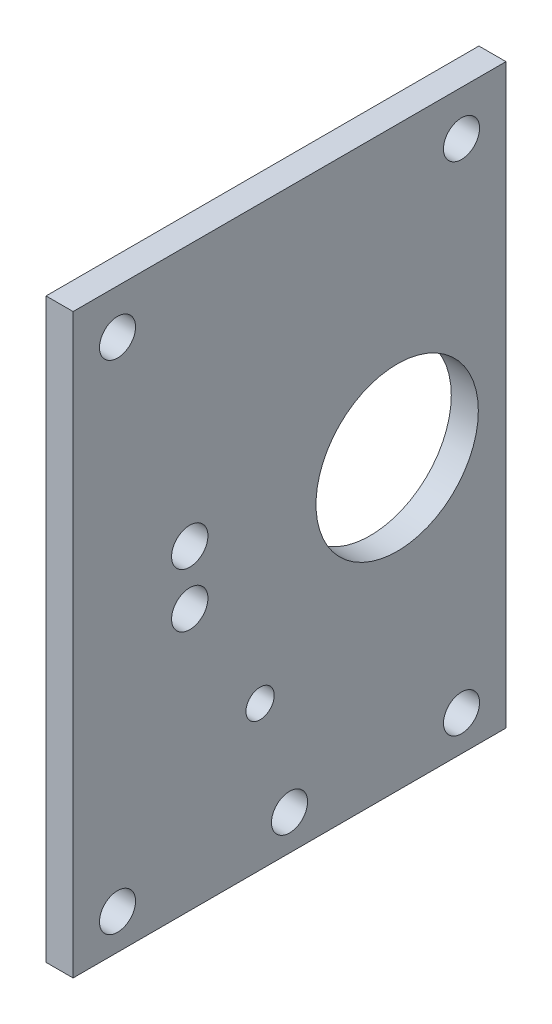
ISO-10303-21;
HEADER;
FILE_DESCRIPTION(('STEP AP214'),'2;1');
FILE_NAME('part.step','',(''),(''),'','','');
FILE_SCHEMA(('AUTOMOTIVE_DESIGN { 1 0 10303 214 1 1 1 1 }'));
ENDSEC;
DATA;
#1=APPLICATION_CONTEXT('core data for automotive mechanical design processes');
#2=APPLICATION_PROTOCOL_DEFINITION('international standard','automotive_design',2000,#1);
#3=PRODUCT_CONTEXT('',#1,'mechanical');
#4=PRODUCT('Part','Part','',(#3));
#5=PRODUCT_RELATED_PRODUCT_CATEGORY('part','',(#4));
#6=PRODUCT_DEFINITION_FORMATION('','',#4);
#7=PRODUCT_DEFINITION_CONTEXT('part definition',#1,'design');
#8=PRODUCT_DEFINITION('design','',#6,#7);
#9=PRODUCT_DEFINITION_SHAPE('','',#8);
#10=(LENGTH_UNIT() NAMED_UNIT(*) SI_UNIT(.MILLI.,.METRE.));
#11=(NAMED_UNIT(*) PLANE_ANGLE_UNIT() SI_UNIT($,.RADIAN.));
#12=(NAMED_UNIT(*) SI_UNIT($,.STERADIAN.) SOLID_ANGLE_UNIT());
#13=UNCERTAINTY_MEASURE_WITH_UNIT(LENGTH_MEASURE(1.E-05),#10,'distance_accuracy_value','');
#14=(GEOMETRIC_REPRESENTATION_CONTEXT(3) GLOBAL_UNCERTAINTY_ASSIGNED_CONTEXT((#13)) GLOBAL_UNIT_ASSIGNED_CONTEXT((#10,
#11,#12)) REPRESENTATION_CONTEXT('',''));
#15=CARTESIAN_POINT('',(0.,0.,0.));
#16=DIRECTION('',(0.,0.,1.));
#17=DIRECTION('',(1.,0.,0.));
#18=AXIS2_PLACEMENT_3D('',#15,#16,#17);
#19=CARTESIAN_POINT('',(4.7625,-50.8,-38.1));
#20=DIRECTION('',(0.,0.,1.));
#21=DIRECTION('',(1.,0.,0.));
#22=AXIS2_PLACEMENT_3D('',#19,#20,#21);
#23=PLANE('',#22);
#24=DIRECTION('',(0.,1.,0.));
#25=VECTOR('',#24,1.);
#26=CARTESIAN_POINT('',(0.,-50.8,-38.1));
#27=LINE('',#26,#25);
#28=CARTESIAN_POINT('',(0.,-50.8,-38.1));
#29=VERTEX_POINT('',#28);
#30=CARTESIAN_POINT('',(0.,50.8,-38.1));
#31=VERTEX_POINT('',#30);
#32=EDGE_CURVE('E99',#29,#31,#27,.T.);
#33=ORIENTED_EDGE('',*,*,#32,.T.);
#34=DIRECTION('',(-1.,0.,0.));
#35=VECTOR('',#34,1.);
#36=CARTESIAN_POINT('',(4.7625,50.8,-38.1));
#37=LINE('',#36,#35);
#38=CARTESIAN_POINT('',(4.7625,50.8,-38.1));
#39=VERTEX_POINT('',#38);
#40=EDGE_CURVE('E11',#39,#31,#37,.T.);
#41=ORIENTED_EDGE('',*,*,#40,.F.);
#42=DIRECTION('',(0.,1.,0.));
#43=VECTOR('',#42,1.);
#44=CARTESIAN_POINT('',(4.7625,-50.8,-38.1));
#45=LINE('',#44,#43);
#46=CARTESIAN_POINT('',(4.7625,-50.8,-38.1));
#47=VERTEX_POINT('',#46);
#48=EDGE_CURVE('E86',#47,#39,#45,.T.);
#49=ORIENTED_EDGE('',*,*,#48,.F.);
#50=DIRECTION('',(-1.,0.,0.));
#51=VECTOR('',#50,1.);
#52=CARTESIAN_POINT('',(4.7625,-50.8,-38.1));
#53=LINE('',#52,#51);
#54=EDGE_CURVE('E95',#47,#29,#53,.T.);
#55=ORIENTED_EDGE('',*,*,#54,.T.);
#56=EDGE_LOOP('',(#33,#41,#49,#55));
#57=FACE_BOUND('',#56,.T.);
#58=ADVANCED_FACE('F33',(#57),#23,.F.);
#59=CARTESIAN_POINT('',(4.7625,50.8,38.1));
#60=DIRECTION('',(0.,-1.,0.));
#61=DIRECTION('',(0.,0.,-1.));
#62=AXIS2_PLACEMENT_3D('',#59,#60,#61);
#63=PLANE('',#62);
#64=DIRECTION('',(0.,0.,1.));
#65=VECTOR('',#64,1.);
#66=CARTESIAN_POINT('',(0.,50.8,38.1));
#67=LINE('',#66,#65);
#68=CARTESIAN_POINT('',(0.,50.8,38.1));
#69=VERTEX_POINT('',#68);
#70=EDGE_CURVE('E90',#31,#69,#67,.T.);
#71=ORIENTED_EDGE('',*,*,#70,.T.);
#72=DIRECTION('',(-1.,0.,0.));
#73=VECTOR('',#72,1.);
#74=CARTESIAN_POINT('',(4.7625,50.8,38.1));
#75=LINE('',#74,#73);
#76=CARTESIAN_POINT('',(4.7625,50.8,38.1));
#77=VERTEX_POINT('',#76);
#78=EDGE_CURVE('E42',#77,#69,#75,.T.);
#79=ORIENTED_EDGE('',*,*,#78,.F.);
#80=DIRECTION('',(0.,0.,1.));
#81=VECTOR('',#80,1.);
#82=CARTESIAN_POINT('',(4.7625,50.8,38.1));
#83=LINE('',#82,#81);
#84=EDGE_CURVE('E81',#39,#77,#83,.T.);
#85=ORIENTED_EDGE('',*,*,#84,.F.);
#86=ORIENTED_EDGE('',*,*,#40,.T.);
#87=EDGE_LOOP('',(#71,#79,#85,#86));
#88=FACE_BOUND('',#87,.T.);
#89=ADVANCED_FACE('F89',(#88),#63,.F.);
#90=CARTESIAN_POINT('',(4.7625,-50.8,38.1));
#91=DIRECTION('',(0.,0.,-1.));
#92=DIRECTION('',(-1.,0.,0.));
#93=AXIS2_PLACEMENT_3D('',#90,#91,#92);
#94=PLANE('',#93);
#95=DIRECTION('',(0.,-1.,0.));
#96=VECTOR('',#95,1.);
#97=CARTESIAN_POINT('',(0.,-50.8,38.1));
#98=LINE('',#97,#96);
#99=CARTESIAN_POINT('',(0.,-50.8,38.1));
#100=VERTEX_POINT('',#99);
#101=EDGE_CURVE('E68',#69,#100,#98,.T.);
#102=ORIENTED_EDGE('',*,*,#101,.T.);
#103=DIRECTION('',(-1.,0.,0.));
#104=VECTOR('',#103,1.);
#105=CARTESIAN_POINT('',(4.7625,-50.8,38.1));
#106=LINE('',#105,#104);
#107=CARTESIAN_POINT('',(4.7625,-50.8,38.1));
#108=VERTEX_POINT('',#107);
#109=EDGE_CURVE('E91',#108,#100,#106,.T.);
#110=ORIENTED_EDGE('',*,*,#109,.F.);
#111=DIRECTION('',(0.,-1.,0.));
#112=VECTOR('',#111,1.);
#113=CARTESIAN_POINT('',(4.7625,-50.8,38.1));
#114=LINE('',#113,#112);
#115=EDGE_CURVE('E84',#77,#108,#114,.T.);
#116=ORIENTED_EDGE('',*,*,#115,.F.);
#117=ORIENTED_EDGE('',*,*,#78,.T.);
#118=EDGE_LOOP('',(#102,#110,#116,#117));
#119=FACE_BOUND('',#118,.T.);
#120=ADVANCED_FACE('F93',(#119),#94,.F.);
#121=CARTESIAN_POINT('',(4.7625,-50.8,38.1));
#122=DIRECTION('',(0.,1.,0.));
#123=DIRECTION('',(0.,0.,1.));
#124=AXIS2_PLACEMENT_3D('',#121,#122,#123);
#125=PLANE('',#124);
#126=DIRECTION('',(0.,0.,-1.));
#127=VECTOR('',#126,1.);
#128=CARTESIAN_POINT('',(0.,-50.8,38.1));
#129=LINE('',#128,#127);
#130=EDGE_CURVE('E74',#100,#29,#129,.T.);
#131=ORIENTED_EDGE('',*,*,#130,.T.);
#132=ORIENTED_EDGE('',*,*,#54,.F.);
#133=DIRECTION('',(0.,0.,-1.));
#134=VECTOR('',#133,1.);
#135=CARTESIAN_POINT('',(4.7625,-50.8,38.1));
#136=LINE('',#135,#134);
#137=EDGE_CURVE('E51',#108,#47,#136,.T.);
#138=ORIENTED_EDGE('',*,*,#137,.F.);
#139=ORIENTED_EDGE('',*,*,#109,.T.);
#140=EDGE_LOOP('',(#131,#132,#138,#139));
#141=FACE_BOUND('',#140,.T.);
#142=ADVANCED_FACE('F155',(#141),#125,.F.);
#143=CARTESIAN_POINT('',(4.7625,0.,0.));
#144=DIRECTION('',(-1.,0.,0.));
#145=DIRECTION('',(0.,0.,1.));
#146=AXIS2_PLACEMENT_3D('',#143,#144,#145);
#147=PLANE('',#146);
#148=CARTESIAN_POINT('',(4.7625,-4.76250000000003,17.5641));
#149=DIRECTION('',(1.,0.,0.));
#150=DIRECTION('',(0.,0.,-1.));
#151=AXIS2_PLACEMENT_3D('',#148,#149,#150);
#152=CIRCLE('',#151,3.19999999999999);
#153=CARTESIAN_POINT('',(4.7625,-4.76250000000003,14.3641));
#154=VERTEX_POINT('',#153);
#155=EDGE_CURVE('E286',#154,#154,#152,.T.);
#156=ORIENTED_EDGE('',*,*,#155,.F.);
#157=EDGE_LOOP('',(#156));
#158=FACE_BOUND('',#157,.T.);
#159=CARTESIAN_POINT('',(4.7625,4.76249999999997,17.5641));
#160=DIRECTION('',(1.,0.,0.));
#161=DIRECTION('',(0.,0.,-1.));
#162=AXIS2_PLACEMENT_3D('',#159,#160,#161);
#163=CIRCLE('',#162,3.19999999999999);
#164=CARTESIAN_POINT('',(4.7625,4.76249999999997,14.3641));
#165=VERTEX_POINT('',#164);
#166=EDGE_CURVE('E290',#165,#165,#163,.T.);
#167=ORIENTED_EDGE('',*,*,#166,.F.);
#168=EDGE_LOOP('',(#167));
#169=FACE_BOUND('',#168,.T.);
#170=CARTESIAN_POINT('',(4.7625,-44.5643,0.));
#171=DIRECTION('',(1.,0.,0.));
#172=DIRECTION('',(0.,0.,-1.));
#173=AXIS2_PLACEMENT_3D('',#170,#171,#172);
#174=CIRCLE('',#173,3.175);
#175=CARTESIAN_POINT('',(4.7625,-44.5643,-3.175));
#176=VERTEX_POINT('',#175);
#177=EDGE_CURVE('E138',#176,#176,#174,.T.);
#178=ORIENTED_EDGE('',*,*,#177,.F.);
#179=EDGE_LOOP('',(#178));
#180=FACE_BOUND('',#179,.T.);
#181=CARTESIAN_POINT('',(4.7625,-25.4,5.1816));
#182=DIRECTION('',(1.,0.,0.));
#183=DIRECTION('',(0.,0.,-1.));
#184=AXIS2_PLACEMENT_3D('',#181,#182,#183);
#185=CIRCLE('',#184,2.4892);
#186=CARTESIAN_POINT('',(4.7625,-25.4,2.6924));
#187=VERTEX_POINT('',#186);
#188=EDGE_CURVE('E128',#187,#187,#185,.T.);
#189=ORIENTED_EDGE('',*,*,#188,.F.);
#190=EDGE_LOOP('',(#189));
#191=FACE_BOUND('',#190,.T.);
#192=CARTESIAN_POINT('',(4.7625,0.,-18.9484));
#193=DIRECTION('',(1.,0.,0.));
#194=DIRECTION('',(0.,0.,-1.));
#195=AXIS2_PLACEMENT_3D('',#192,#193,#194);
#196=CIRCLE('',#195,14.2875);
#197=CARTESIAN_POINT('',(4.7625,0.,-33.2359));
#198=VERTEX_POINT('',#197);
#199=EDGE_CURVE('E125',#198,#198,#196,.T.);
#200=ORIENTED_EDGE('',*,*,#199,.F.);
#201=EDGE_LOOP('',(#200));
#202=FACE_BOUND('',#201,.T.);
#203=CARTESIAN_POINT('',(4.7625,-44.5643,30.2768));
#204=DIRECTION('',(1.,0.,0.));
#205=DIRECTION('',(0.,0.,-1.));
#206=AXIS2_PLACEMENT_3D('',#203,#204,#205);
#207=CIRCLE('',#206,3.175);
#208=CARTESIAN_POINT('',(4.7625,-44.5643,27.1018));
#209=VERTEX_POINT('',#208);
#210=EDGE_CURVE('E122',#209,#209,#207,.T.);
#211=ORIENTED_EDGE('',*,*,#210,.F.);
#212=EDGE_LOOP('',(#211));
#213=FACE_BOUND('',#212,.T.);
#214=CARTESIAN_POINT('',(4.7625,42.9768,30.2768));
#215=DIRECTION('',(1.,0.,0.));
#216=DIRECTION('',(0.,0.,-1.));
#217=AXIS2_PLACEMENT_3D('',#214,#215,#216);
#218=CIRCLE('',#217,3.175);
#219=CARTESIAN_POINT('',(4.7625,42.9768,27.1018));
#220=VERTEX_POINT('',#219);
#221=EDGE_CURVE('E118',#220,#220,#218,.T.);
#222=ORIENTED_EDGE('',*,*,#221,.F.);
#223=EDGE_LOOP('',(#222));
#224=FACE_BOUND('',#223,.T.);
#225=CARTESIAN_POINT('',(4.7625,-44.5643,-30.2768));
#226=DIRECTION('',(1.,0.,0.));
#227=DIRECTION('',(0.,0.,-1.));
#228=AXIS2_PLACEMENT_3D('',#225,#226,#227);
#229=CIRCLE('',#228,3.17499999999999);
#230=CARTESIAN_POINT('',(4.7625,-44.5643,-33.4518));
#231=VERTEX_POINT('',#230);
#232=EDGE_CURVE('E114',#231,#231,#229,.T.);
#233=ORIENTED_EDGE('',*,*,#232,.F.);
#234=EDGE_LOOP('',(#233));
#235=FACE_BOUND('',#234,.T.);
#236=CARTESIAN_POINT('',(4.7625,42.9768,-30.2768));
#237=DIRECTION('',(1.,0.,0.));
#238=DIRECTION('',(0.,0.,-1.));
#239=AXIS2_PLACEMENT_3D('',#236,#237,#238);
#240=CIRCLE('',#239,3.175);
#241=CARTESIAN_POINT('',(4.7625,42.9768,-33.4518));
#242=VERTEX_POINT('',#241);
#243=EDGE_CURVE('E110',#242,#242,#240,.T.);
#244=ORIENTED_EDGE('',*,*,#243,.F.);
#245=EDGE_LOOP('',(#244));
#246=FACE_BOUND('',#245,.T.);
#247=ORIENTED_EDGE('',*,*,#48,.T.);
#248=ORIENTED_EDGE('',*,*,#84,.T.);
#249=ORIENTED_EDGE('',*,*,#115,.T.);
#250=ORIENTED_EDGE('',*,*,#137,.T.);
#251=EDGE_LOOP('',(#247,#248,#249,#250));
#252=FACE_BOUND('',#251,.T.);
#253=ADVANCED_FACE('F82',(#158,#169,#180,#191,#202,#213,#224,#235,#246,#252),#147,.F.);
#254=CARTESIAN_POINT('',(0.,0.,0.));
#255=DIRECTION('',(-1.,0.,0.));
#256=DIRECTION('',(0.,0.,1.));
#257=AXIS2_PLACEMENT_3D('',#254,#255,#256);
#258=PLANE('',#257);
#259=CARTESIAN_POINT('',(0.,-4.76250000000003,17.5641));
#260=DIRECTION('',(-1.,0.,0.));
#261=DIRECTION('',(0.,0.,1.));
#262=AXIS2_PLACEMENT_3D('',#259,#260,#261);
#263=CIRCLE('',#262,3.19999999999999);
#264=CARTESIAN_POINT('',(0.,-4.76250000000003,20.7641));
#265=VERTEX_POINT('',#264);
#266=EDGE_CURVE('E289',#265,#265,#263,.T.);
#267=ORIENTED_EDGE('',*,*,#266,.F.);
#268=EDGE_LOOP('',(#267));
#269=FACE_BOUND('',#268,.T.);
#270=CARTESIAN_POINT('',(0.,4.76249999999997,17.5641));
#271=DIRECTION('',(-1.,0.,0.));
#272=DIRECTION('',(0.,0.,1.));
#273=AXIS2_PLACEMENT_3D('',#270,#271,#272);
#274=CIRCLE('',#273,3.19999999999999);
#275=CARTESIAN_POINT('',(0.,4.76249999999997,20.7641));
#276=VERTEX_POINT('',#275);
#277=EDGE_CURVE('E293',#276,#276,#274,.T.);
#278=ORIENTED_EDGE('',*,*,#277,.F.);
#279=EDGE_LOOP('',(#278));
#280=FACE_BOUND('',#279,.T.);
#281=CARTESIAN_POINT('',(0.,-44.5643,0.));
#282=DIRECTION('',(-1.,0.,0.));
#283=DIRECTION('',(0.,0.,1.));
#284=AXIS2_PLACEMENT_3D('',#281,#282,#283);
#285=CIRCLE('',#284,3.175);
#286=CARTESIAN_POINT('',(0.,-44.5643,3.175));
#287=VERTEX_POINT('',#286);
#288=EDGE_CURVE('E36',#287,#287,#285,.T.);
#289=ORIENTED_EDGE('',*,*,#288,.F.);
#290=EDGE_LOOP('',(#289));
#291=FACE_BOUND('',#290,.T.);
#292=CARTESIAN_POINT('',(0.,-25.4,5.1816));
#293=DIRECTION('',(-1.,0.,0.));
#294=DIRECTION('',(0.,0.,1.));
#295=AXIS2_PLACEMENT_3D('',#292,#293,#294);
#296=CIRCLE('',#295,2.4892);
#297=CARTESIAN_POINT('',(0.,-25.4,7.6708));
#298=VERTEX_POINT('',#297);
#299=EDGE_CURVE('E126',#298,#298,#296,.T.);
#300=ORIENTED_EDGE('',*,*,#299,.F.);
#301=EDGE_LOOP('',(#300));
#302=FACE_BOUND('',#301,.T.);
#303=CARTESIAN_POINT('',(0.,0.,-18.9484));
#304=DIRECTION('',(-1.,0.,0.));
#305=DIRECTION('',(0.,0.,1.));
#306=AXIS2_PLACEMENT_3D('',#303,#304,#305);
#307=CIRCLE('',#306,14.2875);
#308=CARTESIAN_POINT('',(0.,0.,-4.66089999999999));
#309=VERTEX_POINT('',#308);
#310=EDGE_CURVE('E123',#309,#309,#307,.T.);
#311=ORIENTED_EDGE('',*,*,#310,.F.);
#312=EDGE_LOOP('',(#311));
#313=FACE_BOUND('',#312,.T.);
#314=CARTESIAN_POINT('',(0.,-44.5643,30.2768));
#315=DIRECTION('',(-1.,0.,0.));
#316=DIRECTION('',(0.,0.,1.));
#317=AXIS2_PLACEMENT_3D('',#314,#315,#316);
#318=CIRCLE('',#317,3.175);
#319=CARTESIAN_POINT('',(0.,-44.5643,33.4518));
#320=VERTEX_POINT('',#319);
#321=EDGE_CURVE('E119',#320,#320,#318,.T.);
#322=ORIENTED_EDGE('',*,*,#321,.F.);
#323=EDGE_LOOP('',(#322));
#324=FACE_BOUND('',#323,.T.);
#325=CARTESIAN_POINT('',(0.,42.9768,30.2768));
#326=DIRECTION('',(-1.,0.,0.));
#327=DIRECTION('',(0.,0.,1.));
#328=AXIS2_PLACEMENT_3D('',#325,#326,#327);
#329=CIRCLE('',#328,3.175);
#330=CARTESIAN_POINT('',(0.,42.9768,33.4518));
#331=VERTEX_POINT('',#330);
#332=EDGE_CURVE('E115',#331,#331,#329,.T.);
#333=ORIENTED_EDGE('',*,*,#332,.F.);
#334=EDGE_LOOP('',(#333));
#335=FACE_BOUND('',#334,.T.);
#336=CARTESIAN_POINT('',(0.,-44.5643,-30.2768));
#337=DIRECTION('',(-1.,0.,0.));
#338=DIRECTION('',(0.,0.,1.));
#339=AXIS2_PLACEMENT_3D('',#336,#337,#338);
#340=CIRCLE('',#339,3.17499999999999);
#341=CARTESIAN_POINT('',(0.,-44.5643,-27.1018));
#342=VERTEX_POINT('',#341);
#343=EDGE_CURVE('E111',#342,#342,#340,.T.);
#344=ORIENTED_EDGE('',*,*,#343,.F.);
#345=EDGE_LOOP('',(#344));
#346=FACE_BOUND('',#345,.T.);
#347=CARTESIAN_POINT('',(0.,42.9768,-30.2768));
#348=DIRECTION('',(-1.,0.,0.));
#349=DIRECTION('',(0.,0.,1.));
#350=AXIS2_PLACEMENT_3D('',#347,#348,#349);
#351=CIRCLE('',#350,3.175);
#352=CARTESIAN_POINT('',(0.,42.9768,-27.1018));
#353=VERTEX_POINT('',#352);
#354=EDGE_CURVE('E102',#353,#353,#351,.T.);
#355=ORIENTED_EDGE('',*,*,#354,.F.);
#356=EDGE_LOOP('',(#355));
#357=FACE_BOUND('',#356,.T.);
#358=ORIENTED_EDGE('',*,*,#32,.F.);
#359=ORIENTED_EDGE('',*,*,#130,.F.);
#360=ORIENTED_EDGE('',*,*,#101,.F.);
#361=ORIENTED_EDGE('',*,*,#70,.F.);
#362=EDGE_LOOP('',(#358,#359,#360,#361));
#363=FACE_BOUND('',#362,.T.);
#364=ADVANCED_FACE('F154',(#269,#280,#291,#302,#313,#324,#335,#346,#357,#363),#258,.T.);
#365=CARTESIAN_POINT('',(-1.5875,42.9768,-30.2768));
#366=DIRECTION('',(1.,0.,0.));
#367=DIRECTION('',(0.,0.,-1.));
#368=AXIS2_PLACEMENT_3D('',#365,#366,#367);
#369=CYLINDRICAL_SURFACE('',#368,3.175);
#370=ORIENTED_EDGE('',*,*,#354,.T.);
#371=EDGE_LOOP('',(#370));
#372=FACE_BOUND('',#371,.T.);
#373=ORIENTED_EDGE('',*,*,#243,.T.);
#374=EDGE_LOOP('',(#373));
#375=FACE_BOUND('',#374,.T.);
#376=ADVANCED_FACE('F151',(#372,#375),#369,.F.);
#377=CARTESIAN_POINT('',(-1.5875,-44.5643,-30.2768));
#378=DIRECTION('',(1.,0.,0.));
#379=DIRECTION('',(0.,0.,-1.));
#380=AXIS2_PLACEMENT_3D('',#377,#378,#379);
#381=CYLINDRICAL_SURFACE('',#380,3.17499999999999);
#382=ORIENTED_EDGE('',*,*,#343,.T.);
#383=EDGE_LOOP('',(#382));
#384=FACE_BOUND('',#383,.T.);
#385=ORIENTED_EDGE('',*,*,#232,.T.);
#386=EDGE_LOOP('',(#385));
#387=FACE_BOUND('',#386,.T.);
#388=ADVANCED_FACE('F204',(#384,#387),#381,.F.);
#389=CARTESIAN_POINT('',(-1.5875,42.9768,30.2768));
#390=DIRECTION('',(1.,0.,0.));
#391=DIRECTION('',(0.,0.,-1.));
#392=AXIS2_PLACEMENT_3D('',#389,#390,#391);
#393=CYLINDRICAL_SURFACE('',#392,3.175);
#394=ORIENTED_EDGE('',*,*,#332,.T.);
#395=EDGE_LOOP('',(#394));
#396=FACE_BOUND('',#395,.T.);
#397=ORIENTED_EDGE('',*,*,#221,.T.);
#398=EDGE_LOOP('',(#397));
#399=FACE_BOUND('',#398,.T.);
#400=ADVANCED_FACE('F210',(#396,#399),#393,.F.);
#401=CARTESIAN_POINT('',(-1.5875,-44.5643,30.2768));
#402=DIRECTION('',(1.,0.,0.));
#403=DIRECTION('',(0.,0.,-1.));
#404=AXIS2_PLACEMENT_3D('',#401,#402,#403);
#405=CYLINDRICAL_SURFACE('',#404,3.175);
#406=ORIENTED_EDGE('',*,*,#321,.T.);
#407=EDGE_LOOP('',(#406));
#408=FACE_BOUND('',#407,.T.);
#409=ORIENTED_EDGE('',*,*,#210,.T.);
#410=EDGE_LOOP('',(#409));
#411=FACE_BOUND('',#410,.T.);
#412=ADVANCED_FACE('F218',(#408,#411),#405,.F.);
#413=CARTESIAN_POINT('',(-1.5875,0.,-18.9484));
#414=DIRECTION('',(1.,0.,0.));
#415=DIRECTION('',(0.,0.,-1.));
#416=AXIS2_PLACEMENT_3D('',#413,#414,#415);
#417=CYLINDRICAL_SURFACE('',#416,14.2875);
#418=ORIENTED_EDGE('',*,*,#310,.T.);
#419=EDGE_LOOP('',(#418));
#420=FACE_BOUND('',#419,.T.);
#421=ORIENTED_EDGE('',*,*,#199,.T.);
#422=EDGE_LOOP('',(#421));
#423=FACE_BOUND('',#422,.T.);
#424=ADVANCED_FACE('F226',(#420,#423),#417,.F.);
#425=CARTESIAN_POINT('',(-1.5875,-25.4,5.1816));
#426=DIRECTION('',(1.,0.,0.));
#427=DIRECTION('',(0.,0.,-1.));
#428=AXIS2_PLACEMENT_3D('',#425,#426,#427);
#429=CYLINDRICAL_SURFACE('',#428,2.4892);
#430=ORIENTED_EDGE('',*,*,#299,.T.);
#431=EDGE_LOOP('',(#430));
#432=FACE_BOUND('',#431,.T.);
#433=ORIENTED_EDGE('',*,*,#188,.T.);
#434=EDGE_LOOP('',(#433));
#435=FACE_BOUND('',#434,.T.);
#436=ADVANCED_FACE('F234',(#432,#435),#429,.F.);
#437=CARTESIAN_POINT('',(-1.5875,-44.5643,0.));
#438=DIRECTION('',(1.,0.,0.));
#439=DIRECTION('',(0.,0.,-1.));
#440=AXIS2_PLACEMENT_3D('',#437,#438,#439);
#441=CYLINDRICAL_SURFACE('',#440,3.175);
#442=ORIENTED_EDGE('',*,*,#288,.T.);
#443=EDGE_LOOP('',(#442));
#444=FACE_BOUND('',#443,.T.);
#445=ORIENTED_EDGE('',*,*,#177,.T.);
#446=EDGE_LOOP('',(#445));
#447=FACE_BOUND('',#446,.T.);
#448=ADVANCED_FACE('F242',(#444,#447),#441,.F.);
#449=CARTESIAN_POINT('',(4.7625,4.76249999999997,17.5641));
#450=DIRECTION('',(1.,0.,0.));
#451=DIRECTION('',(0.,0.,-1.));
#452=AXIS2_PLACEMENT_3D('',#449,#450,#451);
#453=CYLINDRICAL_SURFACE('',#452,3.19999999999999);
#454=ORIENTED_EDGE('',*,*,#166,.T.);
#455=EDGE_LOOP('',(#454));
#456=FACE_BOUND('',#455,.T.);
#457=ORIENTED_EDGE('',*,*,#277,.T.);
#458=EDGE_LOOP('',(#457));
#459=FACE_BOUND('',#458,.T.);
#460=ADVANCED_FACE('F248',(#456,#459),#453,.F.);
#461=CARTESIAN_POINT('',(4.7625,-4.76250000000003,17.5641));
#462=DIRECTION('',(1.,0.,0.));
#463=DIRECTION('',(0.,0.,-1.));
#464=AXIS2_PLACEMENT_3D('',#461,#462,#463);
#465=CYLINDRICAL_SURFACE('',#464,3.19999999999999);
#466=ORIENTED_EDGE('',*,*,#155,.T.);
#467=EDGE_LOOP('',(#466));
#468=FACE_BOUND('',#467,.T.);
#469=ORIENTED_EDGE('',*,*,#266,.T.);
#470=EDGE_LOOP('',(#469));
#471=FACE_BOUND('',#470,.T.);
#472=ADVANCED_FACE('F255',(#468,#471),#465,.F.);
#473=CLOSED_SHELL('',(#58,#89,#120,#142,#253,#364,#376,#388,#400,#412,#424,#436,#448,#460,#472));
#474=MANIFOLD_SOLID_BREP('B2',#473);
#475=ADVANCED_BREP_SHAPE_REPRESENTATION('',(#18,#474),#14);
#476=SHAPE_DEFINITION_REPRESENTATION(#9,#475);
ENDSEC;
END-ISO-10303-21;
